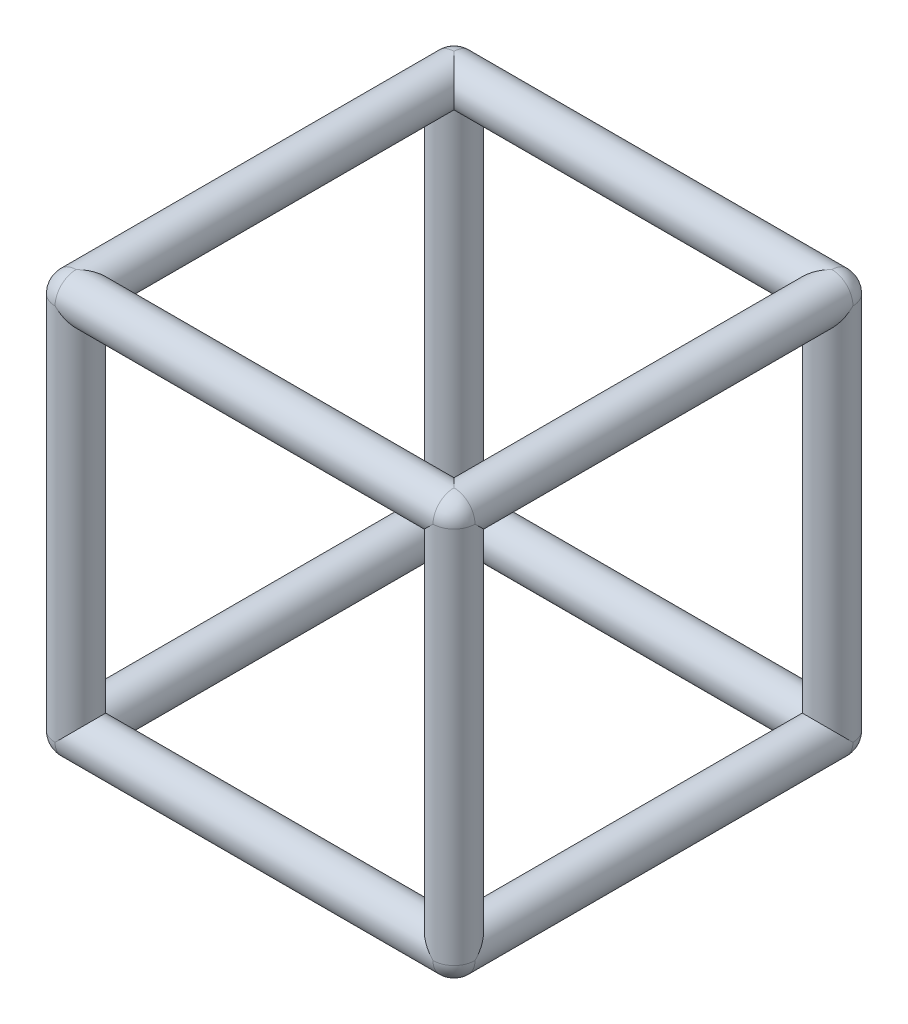
ISO-10303-21;
HEADER;
FILE_DESCRIPTION(('STEP AP214'),'2;1');
FILE_NAME('part.step','',(''),(''),'','','');
FILE_SCHEMA(('AUTOMOTIVE_DESIGN { 1 0 10303 214 1 1 1 1 }'));
ENDSEC;
DATA;
#1=APPLICATION_CONTEXT('core data for automotive mechanical design processes');
#2=APPLICATION_PROTOCOL_DEFINITION('international standard','automotive_design',2000,#1);
#3=PRODUCT_CONTEXT('',#1,'mechanical');
#4=PRODUCT('Part','Part','',(#3));
#5=PRODUCT_RELATED_PRODUCT_CATEGORY('part','',(#4));
#6=PRODUCT_DEFINITION_FORMATION('','',#4);
#7=PRODUCT_DEFINITION_CONTEXT('part definition',#1,'design');
#8=PRODUCT_DEFINITION('design','',#6,#7);
#9=PRODUCT_DEFINITION_SHAPE('','',#8);
#10=(LENGTH_UNIT() NAMED_UNIT(*) SI_UNIT(.MILLI.,.METRE.));
#11=(NAMED_UNIT(*) PLANE_ANGLE_UNIT() SI_UNIT($,.RADIAN.));
#12=(NAMED_UNIT(*) SI_UNIT($,.STERADIAN.) SOLID_ANGLE_UNIT());
#13=UNCERTAINTY_MEASURE_WITH_UNIT(LENGTH_MEASURE(1.E-05),#10,'distance_accuracy_value','');
#14=(GEOMETRIC_REPRESENTATION_CONTEXT(3) GLOBAL_UNCERTAINTY_ASSIGNED_CONTEXT((#13)) GLOBAL_UNIT_ASSIGNED_CONTEXT((#10,
#11,#12)) REPRESENTATION_CONTEXT('',''));
#15=CARTESIAN_POINT('',(0.,0.,0.));
#16=DIRECTION('',(0.,0.,1.));
#17=DIRECTION('',(1.,0.,0.));
#18=AXIS2_PLACEMENT_3D('',#15,#16,#17);
#19=CARTESIAN_POINT('',(-114.3,254.,-114.3));
#20=DIRECTION('',(0.,-1.,0.));
#21=DIRECTION('',(0.,0.,-1.));
#22=AXIS2_PLACEMENT_3D('',#19,#20,#21);
#23=CYLINDRICAL_SURFACE('',#22,12.7);
#24=CARTESIAN_POINT('',(-114.3,241.3,-114.3));
#25=DIRECTION('',(0.,-0.707106781186547,-0.707106781186547));
#26=DIRECTION('',(0.,-0.707106781186547,0.707106781186547));
#27=AXIS2_PLACEMENT_3D('',#24,#25,#26);
#28=ELLIPSE('',#27,17.9605122421383,12.7);
#29=CARTESIAN_POINT('',(-127.,241.3,-114.3));
#30=VERTEX_POINT('',#29);
#31=CARTESIAN_POINT('',(-105.319743878931,232.319743878931,-105.319743878931));
#32=VERTEX_POINT('',#31);
#33=EDGE_CURVE('E245',#30,#32,#28,.F.);
#34=ORIENTED_EDGE('',*,*,#33,.F.);
#35=CARTESIAN_POINT('',(-114.3,241.3,-114.3));
#36=DIRECTION('',(0.,-1.,0.));
#37=DIRECTION('',(0.,0.,-1.));
#38=AXIS2_PLACEMENT_3D('',#35,#36,#37);
#39=CIRCLE('',#38,12.7);
#40=CARTESIAN_POINT('',(-114.3,241.3,-127.));
#41=VERTEX_POINT('',#40);
#42=EDGE_CURVE('E264',#30,#41,#39,.T.);
#43=ORIENTED_EDGE('',*,*,#42,.T.);
#44=CARTESIAN_POINT('',(-114.3,241.3,-114.3));
#45=DIRECTION('',(-0.707106781186547,-0.707106781186547,0.));
#46=DIRECTION('',(0.707106781186547,-0.707106781186547,0.));
#47=AXIS2_PLACEMENT_3D('',#44,#45,#46);
#48=ELLIPSE('',#47,17.9605122421383,12.7);
#49=EDGE_CURVE('E258',#32,#41,#48,.F.);
#50=ORIENTED_EDGE('',*,*,#49,.F.);
#51=EDGE_LOOP('',(#34,#43,#50));
#52=FACE_BOUND('',#51,.T.);
#53=CARTESIAN_POINT('',(-114.3,12.7,-114.3));
#54=DIRECTION('',(0.,-0.707106781186547,0.707106781186547));
#55=DIRECTION('',(0.,-0.707106781186547,-0.707106781186547));
#56=AXIS2_PLACEMENT_3D('',#53,#54,#55);
#57=ELLIPSE('',#56,17.9605122421383,12.7);
#58=CARTESIAN_POINT('',(-105.319743878931,21.6802561210692,-105.319743878931));
#59=VERTEX_POINT('',#58);
#60=CARTESIAN_POINT('',(-127.,12.7,-114.3));
#61=VERTEX_POINT('',#60);
#62=EDGE_CURVE('E187',#59,#61,#57,.T.);
#63=ORIENTED_EDGE('',*,*,#62,.F.);
#64=CARTESIAN_POINT('',(-114.3,12.7,-114.3));
#65=DIRECTION('',(0.707106781186547,-0.707106781186547,0.));
#66=DIRECTION('',(-0.707106781186547,-0.707106781186547,0.));
#67=AXIS2_PLACEMENT_3D('',#64,#65,#66);
#68=ELLIPSE('',#67,17.9605122421383,12.7);
#69=CARTESIAN_POINT('',(-114.3,12.7,-127.));
#70=VERTEX_POINT('',#69);
#71=EDGE_CURVE('E250',#70,#59,#68,.T.);
#72=ORIENTED_EDGE('',*,*,#71,.F.);
#73=CARTESIAN_POINT('',(-114.3,12.7,-114.3));
#74=DIRECTION('',(0.,-1.,0.));
#75=DIRECTION('',(0.,0.,-1.));
#76=AXIS2_PLACEMENT_3D('',#73,#74,#75);
#77=CIRCLE('',#76,12.7);
#78=EDGE_CURVE('E161',#70,#61,#77,.F.);
#79=ORIENTED_EDGE('',*,*,#78,.T.);
#80=EDGE_LOOP('',(#63,#72,#79));
#81=FACE_BOUND('',#80,.T.);
#82=ADVANCED_FACE('F39',(#52,#81),#23,.T.);
#83=CARTESIAN_POINT('',(114.3,241.3,-114.3));
#84=DIRECTION('',(-1.,0.,0.));
#85=DIRECTION('',(0.,0.,1.));
#86=AXIS2_PLACEMENT_3D('',#83,#84,#85);
#87=CYLINDRICAL_SURFACE('',#86,12.7);
#88=CARTESIAN_POINT('',(-114.3,241.3,-114.3));
#89=DIRECTION('',(-0.707106781186547,0.,0.707106781186547));
#90=DIRECTION('',(-0.707106781186547,0.,-0.707106781186547));
#91=AXIS2_PLACEMENT_3D('',#88,#89,#90);
#92=ELLIPSE('',#91,17.9605122421383,12.7);
#93=CARTESIAN_POINT('',(-114.3,254.,-114.3));
#94=VERTEX_POINT('',#93);
#95=EDGE_CURVE('E237',#32,#94,#92,.T.);
#96=ORIENTED_EDGE('',*,*,#95,.F.);
#97=ORIENTED_EDGE('',*,*,#49,.T.);
#98=CARTESIAN_POINT('',(-114.3,241.3,-114.3));
#99=DIRECTION('',(1.,0.,0.));
#100=DIRECTION('',(0.,0.,-1.));
#101=AXIS2_PLACEMENT_3D('',#98,#99,#100);
#102=CIRCLE('',#101,12.7);
#103=EDGE_CURVE('E253',#41,#94,#102,.T.);
#104=ORIENTED_EDGE('',*,*,#103,.T.);
#105=EDGE_LOOP('',(#96,#97,#104));
#106=FACE_BOUND('',#105,.T.);
#107=CARTESIAN_POINT('',(114.3,241.3,-114.3));
#108=DIRECTION('',(-0.707106781186547,0.,-0.707106781186547));
#109=DIRECTION('',(-0.707106781186547,0.,0.707106781186547));
#110=AXIS2_PLACEMENT_3D('',#107,#108,#109);
#111=ELLIPSE('',#110,17.9605122421383,12.7);
#112=CARTESIAN_POINT('',(114.3,254.,-114.3));
#113=VERTEX_POINT('',#112);
#114=CARTESIAN_POINT('',(105.319743878931,232.319743878931,-105.319743878931));
#115=VERTEX_POINT('',#114);
#116=EDGE_CURVE('E197',#113,#115,#111,.F.);
#117=ORIENTED_EDGE('',*,*,#116,.F.);
#118=CARTESIAN_POINT('',(114.3,241.3,-114.3));
#119=DIRECTION('',(1.,0.,0.));
#120=DIRECTION('',(0.,0.,-1.));
#121=AXIS2_PLACEMENT_3D('',#118,#119,#120);
#122=CIRCLE('',#121,12.7);
#123=CARTESIAN_POINT('',(114.3,241.3,-127.));
#124=VERTEX_POINT('',#123);
#125=EDGE_CURVE('E259',#124,#113,#122,.T.);
#126=ORIENTED_EDGE('',*,*,#125,.F.);
#127=CARTESIAN_POINT('',(114.3,241.3,-114.3));
#128=DIRECTION('',(-0.707106781186547,0.707106781186547,0.));
#129=DIRECTION('',(-0.707106781186547,-0.707106781186547,0.));
#130=AXIS2_PLACEMENT_3D('',#127,#128,#129);
#131=ELLIPSE('',#130,17.9605122421383,12.7);
#132=EDGE_CURVE('E254',#115,#124,#131,.F.);
#133=ORIENTED_EDGE('',*,*,#132,.F.);
#134=EDGE_LOOP('',(#117,#126,#133));
#135=FACE_BOUND('',#134,.T.);
#136=ADVANCED_FACE('F323',(#106,#135),#87,.T.);
#137=CARTESIAN_POINT('',(-114.3,12.7,-114.3));
#138=DIRECTION('',(0.,1.,0.));
#139=DIRECTION('',(0.,0.,1.));
#140=AXIS2_PLACEMENT_3D('',#137,#138,#139);
#141=SPHERICAL_SURFACE('',#140,12.7);
#142=CARTESIAN_POINT('',(-114.3,12.7,-114.3));
#143=DIRECTION('',(1.,0.,0.));
#144=DIRECTION('',(0.,0.,-1.));
#145=AXIS2_PLACEMENT_3D('',#142,#143,#144);
#146=CIRCLE('',#145,12.7);
#147=CARTESIAN_POINT('',(-114.3,0.,-114.3));
#148=VERTEX_POINT('',#147);
#149=EDGE_CURVE('E242',#148,#70,#146,.T.);
#150=ORIENTED_EDGE('',*,*,#149,.F.);
#151=CARTESIAN_POINT('',(-114.3,12.7,-114.3));
#152=DIRECTION('',(0.,0.,1.));
#153=DIRECTION('',(1.,0.,0.));
#154=AXIS2_PLACEMENT_3D('',#151,#152,#153);
#155=CIRCLE('',#154,12.7);
#156=EDGE_CURVE('E53',#61,#148,#155,.T.);
#157=ORIENTED_EDGE('',*,*,#156,.F.);
#158=ORIENTED_EDGE('',*,*,#78,.F.);
#159=EDGE_LOOP('',(#150,#157,#158));
#160=FACE_BOUND('',#159,.T.);
#161=ADVANCED_FACE('F333',(#160),#141,.T.);
#162=CARTESIAN_POINT('',(114.3,254.,-114.3));
#163=DIRECTION('',(0.,-1.,0.));
#164=DIRECTION('',(0.,0.,-1.));
#165=AXIS2_PLACEMENT_3D('',#162,#163,#164);
#166=CYLINDRICAL_SURFACE('',#165,12.7);
#167=CARTESIAN_POINT('',(114.3,12.7,-114.3));
#168=DIRECTION('',(0.,-0.707106781186547,0.707106781186547));
#169=DIRECTION('',(0.,-0.707106781186547,-0.707106781186547));
#170=AXIS2_PLACEMENT_3D('',#167,#168,#169);
#171=ELLIPSE('',#170,17.9605122421383,12.7);
#172=CARTESIAN_POINT('',(127.,12.7,-114.3));
#173=VERTEX_POINT('',#172);
#174=CARTESIAN_POINT('',(105.319743878931,21.6802561210691,-105.319743878931));
#175=VERTEX_POINT('',#174);
#176=EDGE_CURVE('E61',#173,#175,#171,.T.);
#177=ORIENTED_EDGE('',*,*,#176,.F.);
#178=CARTESIAN_POINT('',(114.3,12.7,-114.3));
#179=DIRECTION('',(0.,-1.,0.));
#180=DIRECTION('',(0.,0.,-1.));
#181=AXIS2_PLACEMENT_3D('',#178,#179,#180);
#182=CIRCLE('',#181,12.7);
#183=CARTESIAN_POINT('',(114.3,12.7,-127.));
#184=VERTEX_POINT('',#183);
#185=EDGE_CURVE('E166',#173,#184,#182,.F.);
#186=ORIENTED_EDGE('',*,*,#185,.T.);
#187=CARTESIAN_POINT('',(114.3,12.7,-114.3));
#188=DIRECTION('',(-0.707106781186547,-0.707106781186547,0.));
#189=DIRECTION('',(0.707106781186547,-0.707106781186547,0.));
#190=AXIS2_PLACEMENT_3D('',#187,#188,#189);
#191=ELLIPSE('',#190,17.9605122421383,12.7);
#192=EDGE_CURVE('E163',#175,#184,#191,.T.);
#193=ORIENTED_EDGE('',*,*,#192,.F.);
#194=EDGE_LOOP('',(#177,#186,#193));
#195=FACE_BOUND('',#194,.T.);
#196=CARTESIAN_POINT('',(114.3,241.3,-114.3));
#197=DIRECTION('',(0.,-0.707106781186547,-0.707106781186547));
#198=DIRECTION('',(0.,-0.707106781186547,0.707106781186547));
#199=AXIS2_PLACEMENT_3D('',#196,#197,#198);
#200=ELLIPSE('',#199,17.9605122421383,12.7);
#201=CARTESIAN_POINT('',(127.,241.3,-114.3));
#202=VERTEX_POINT('',#201);
#203=EDGE_CURVE('E192',#115,#202,#200,.F.);
#204=ORIENTED_EDGE('',*,*,#203,.F.);
#205=ORIENTED_EDGE('',*,*,#132,.T.);
#206=CARTESIAN_POINT('',(114.3,241.3,-114.3));
#207=DIRECTION('',(0.,-1.,0.));
#208=DIRECTION('',(0.,0.,-1.));
#209=AXIS2_PLACEMENT_3D('',#206,#207,#208);
#210=CIRCLE('',#209,12.7);
#211=EDGE_CURVE('E248',#124,#202,#210,.T.);
#212=ORIENTED_EDGE('',*,*,#211,.T.);
#213=EDGE_LOOP('',(#204,#205,#212));
#214=FACE_BOUND('',#213,.T.);
#215=ADVANCED_FACE('F336',(#195,#214),#166,.T.);
#216=CARTESIAN_POINT('',(114.3,12.7,-114.3));
#217=DIRECTION('',(0.,1.,0.));
#218=DIRECTION('',(0.,0.,1.));
#219=AXIS2_PLACEMENT_3D('',#216,#217,#218);
#220=SPHERICAL_SURFACE('',#219,12.7);
#221=ORIENTED_EDGE('',*,*,#185,.F.);
#222=CARTESIAN_POINT('',(114.3,12.7,-114.3));
#223=DIRECTION('',(0.,0.,1.));
#224=DIRECTION('',(1.,0.,0.));
#225=AXIS2_PLACEMENT_3D('',#222,#223,#224);
#226=CIRCLE('',#225,12.7);
#227=CARTESIAN_POINT('',(114.3,0.,-114.3));
#228=VERTEX_POINT('',#227);
#229=EDGE_CURVE('E168',#228,#173,#226,.T.);
#230=ORIENTED_EDGE('',*,*,#229,.F.);
#231=CARTESIAN_POINT('',(114.3,12.7,-114.3));
#232=DIRECTION('',(1.,0.,0.));
#233=DIRECTION('',(0.,0.,-1.));
#234=AXIS2_PLACEMENT_3D('',#231,#232,#233);
#235=CIRCLE('',#234,12.7);
#236=EDGE_CURVE('E155',#184,#228,#235,.F.);
#237=ORIENTED_EDGE('',*,*,#236,.F.);
#238=EDGE_LOOP('',(#221,#230,#237));
#239=FACE_BOUND('',#238,.T.);
#240=ADVANCED_FACE('F170',(#239),#220,.T.);
#241=CARTESIAN_POINT('',(114.3,241.3,-114.3));
#242=DIRECTION('',(0.,1.,0.));
#243=DIRECTION('',(0.,0.,1.));
#244=AXIS2_PLACEMENT_3D('',#241,#242,#243);
#245=SPHERICAL_SURFACE('',#244,12.7);
#246=ORIENTED_EDGE('',*,*,#125,.T.);
#247=CARTESIAN_POINT('',(114.3,241.3,-114.3));
#248=DIRECTION('',(0.,0.,1.));
#249=DIRECTION('',(1.,0.,0.));
#250=AXIS2_PLACEMENT_3D('',#247,#248,#249);
#251=CIRCLE('',#250,12.7);
#252=EDGE_CURVE('E291',#202,#113,#251,.T.);
#253=ORIENTED_EDGE('',*,*,#252,.F.);
#254=ORIENTED_EDGE('',*,*,#211,.F.);
#255=EDGE_LOOP('',(#246,#253,#254));
#256=FACE_BOUND('',#255,.T.);
#257=ADVANCED_FACE('F318',(#256),#245,.T.);
#258=CARTESIAN_POINT('',(114.3,12.7,-114.3));
#259=DIRECTION('',(-1.,0.,0.));
#260=DIRECTION('',(0.,0.,1.));
#261=AXIS2_PLACEMENT_3D('',#258,#259,#260);
#262=CYLINDRICAL_SURFACE('',#261,12.7);
#263=CARTESIAN_POINT('',(114.3,12.7,-114.3));
#264=DIRECTION('',(-0.707106781186547,0.,-0.707106781186547));
#265=DIRECTION('',(-0.707106781186547,0.,0.707106781186547));
#266=AXIS2_PLACEMENT_3D('',#263,#264,#265);
#267=ELLIPSE('',#266,17.9605122421383,12.7);
#268=EDGE_CURVE('E156',#175,#228,#267,.F.);
#269=ORIENTED_EDGE('',*,*,#268,.F.);
#270=ORIENTED_EDGE('',*,*,#192,.T.);
#271=ORIENTED_EDGE('',*,*,#236,.T.);
#272=EDGE_LOOP('',(#269,#270,#271));
#273=FACE_BOUND('',#272,.T.);
#274=CARTESIAN_POINT('',(-114.3,12.7,-114.3));
#275=DIRECTION('',(-0.707106781186547,0.,0.707106781186547));
#276=DIRECTION('',(-0.707106781186547,0.,-0.707106781186547));
#277=AXIS2_PLACEMENT_3D('',#274,#275,#276);
#278=ELLIPSE('',#277,17.9605122421383,12.7);
#279=EDGE_CURVE('E182',#148,#59,#278,.T.);
#280=ORIENTED_EDGE('',*,*,#279,.F.);
#281=ORIENTED_EDGE('',*,*,#149,.T.);
#282=ORIENTED_EDGE('',*,*,#71,.T.);
#283=EDGE_LOOP('',(#280,#281,#282));
#284=FACE_BOUND('',#283,.T.);
#285=ADVANCED_FACE('F159',(#273,#284),#262,.T.);
#286=CARTESIAN_POINT('',(-114.3,254.,114.3));
#287=DIRECTION('',(0.,-1.,0.));
#288=DIRECTION('',(0.,0.,-1.));
#289=AXIS2_PLACEMENT_3D('',#286,#287,#288);
#290=CYLINDRICAL_SURFACE('',#289,12.7);
#291=CARTESIAN_POINT('',(-114.3,241.3,114.3));
#292=DIRECTION('',(0.,-1.,0.));
#293=DIRECTION('',(0.,0.,-1.));
#294=AXIS2_PLACEMENT_3D('',#291,#292,#293);
#295=CIRCLE('',#294,12.7);
#296=CARTESIAN_POINT('',(-114.3,241.3,127.));
#297=VERTEX_POINT('',#296);
#298=CARTESIAN_POINT('',(-127.,241.3,114.3));
#299=VERTEX_POINT('',#298);
#300=EDGE_CURVE('E224',#297,#299,#295,.T.);
#301=ORIENTED_EDGE('',*,*,#300,.T.);
#302=CARTESIAN_POINT('',(-114.3,241.3,114.3));
#303=DIRECTION('',(0.,0.707106781186547,-0.707106781186547));
#304=DIRECTION('',(0.,-0.707106781186547,-0.707106781186547));
#305=AXIS2_PLACEMENT_3D('',#302,#303,#304);
#306=ELLIPSE('',#305,17.9605122421383,12.7);
#307=CARTESIAN_POINT('',(-105.319743878931,232.319743878931,105.319743878931));
#308=VERTEX_POINT('',#307);
#309=EDGE_CURVE('E235',#299,#308,#306,.F.);
#310=ORIENTED_EDGE('',*,*,#309,.T.);
#311=CARTESIAN_POINT('',(-114.3,241.3,114.3));
#312=DIRECTION('',(-0.707106781186547,-0.707106781186547,0.));
#313=DIRECTION('',(0.707106781186547,-0.707106781186547,0.));
#314=AXIS2_PLACEMENT_3D('',#311,#312,#313);
#315=ELLIPSE('',#314,17.9605122421383,12.7);
#316=EDGE_CURVE('E219',#297,#308,#315,.F.);
#317=ORIENTED_EDGE('',*,*,#316,.F.);
#318=EDGE_LOOP('',(#301,#310,#317));
#319=FACE_BOUND('',#318,.T.);
#320=CARTESIAN_POINT('',(-114.3,12.7,114.3));
#321=DIRECTION('',(0.,-0.707106781186547,-0.707106781186547));
#322=DIRECTION('',(0.,-0.707106781186547,0.707106781186547));
#323=AXIS2_PLACEMENT_3D('',#320,#321,#322);
#324=ELLIPSE('',#323,17.9605122421383,12.7);
#325=CARTESIAN_POINT('',(-127.,12.7,114.3));
#326=VERTEX_POINT('',#325);
#327=CARTESIAN_POINT('',(-105.319743878931,21.6802561210692,105.319743878931));
#328=VERTEX_POINT('',#327);
#329=EDGE_CURVE('E174',#326,#328,#324,.T.);
#330=ORIENTED_EDGE('',*,*,#329,.F.);
#331=CARTESIAN_POINT('',(-114.3,12.7,114.3));
#332=DIRECTION('',(0.,-1.,0.));
#333=DIRECTION('',(0.,0.,-1.));
#334=AXIS2_PLACEMENT_3D('',#331,#332,#333);
#335=CIRCLE('',#334,12.7);
#336=CARTESIAN_POINT('',(-114.3,12.7,127.));
#337=VERTEX_POINT('',#336);
#338=EDGE_CURVE('E221',#326,#337,#335,.F.);
#339=ORIENTED_EDGE('',*,*,#338,.T.);
#340=CARTESIAN_POINT('',(-114.3,12.7,114.3));
#341=DIRECTION('',(0.707106781186547,-0.707106781186547,0.));
#342=DIRECTION('',(-0.707106781186547,-0.707106781186547,0.));
#343=AXIS2_PLACEMENT_3D('',#340,#341,#342);
#344=ELLIPSE('',#343,17.9605122421383,12.7);
#345=EDGE_CURVE('E202',#328,#337,#344,.T.);
#346=ORIENTED_EDGE('',*,*,#345,.F.);
#347=EDGE_LOOP('',(#330,#339,#346));
#348=FACE_BOUND('',#347,.T.);
#349=ADVANCED_FACE('F309',(#319,#348),#290,.T.);
#350=CARTESIAN_POINT('',(114.3,241.3,114.3));
#351=DIRECTION('',(-1.,0.,0.));
#352=DIRECTION('',(0.,0.,1.));
#353=AXIS2_PLACEMENT_3D('',#350,#351,#352);
#354=CYLINDRICAL_SURFACE('',#353,12.7);
#355=ORIENTED_EDGE('',*,*,#316,.T.);
#356=CARTESIAN_POINT('',(-114.3,241.3,114.3));
#357=DIRECTION('',(-0.707106781186547,0.,-0.707106781186547));
#358=DIRECTION('',(0.707106781186547,0.,-0.707106781186547));
#359=AXIS2_PLACEMENT_3D('',#356,#357,#358);
#360=ELLIPSE('',#359,17.9605122421383,12.7);
#361=CARTESIAN_POINT('',(-114.3,254.,114.3));
#362=VERTEX_POINT('',#361);
#363=EDGE_CURVE('E230',#308,#362,#360,.F.);
#364=ORIENTED_EDGE('',*,*,#363,.T.);
#365=CARTESIAN_POINT('',(-114.3,241.3,114.3));
#366=DIRECTION('',(1.,0.,0.));
#367=DIRECTION('',(0.,0.,-1.));
#368=AXIS2_PLACEMENT_3D('',#365,#366,#367);
#369=CIRCLE('',#368,12.7);
#370=EDGE_CURVE('E212',#362,#297,#369,.T.);
#371=ORIENTED_EDGE('',*,*,#370,.T.);
#372=EDGE_LOOP('',(#355,#364,#371));
#373=FACE_BOUND('',#372,.T.);
#374=CARTESIAN_POINT('',(114.3,241.3,114.3));
#375=DIRECTION('',(-0.707106781186547,0.,0.707106781186547));
#376=DIRECTION('',(-0.707106781186547,0.,-0.707106781186547));
#377=AXIS2_PLACEMENT_3D('',#374,#375,#376);
#378=ELLIPSE('',#377,17.9605122421383,12.7);
#379=CARTESIAN_POINT('',(105.319743878931,232.319743878931,105.319743878931));
#380=VERTEX_POINT('',#379);
#381=CARTESIAN_POINT('',(114.3,254.,114.3));
#382=VERTEX_POINT('',#381);
#383=EDGE_CURVE('E191',#380,#382,#378,.F.);
#384=ORIENTED_EDGE('',*,*,#383,.F.);
#385=CARTESIAN_POINT('',(114.3,241.3,114.3));
#386=DIRECTION('',(-0.707106781186547,0.707106781186547,0.));
#387=DIRECTION('',(-0.707106781186547,-0.707106781186547,0.));
#388=AXIS2_PLACEMENT_3D('',#385,#386,#387);
#389=ELLIPSE('',#388,17.9605122421383,12.7);
#390=CARTESIAN_POINT('',(114.3,241.3,127.));
#391=VERTEX_POINT('',#390);
#392=EDGE_CURVE('E211',#391,#380,#389,.F.);
#393=ORIENTED_EDGE('',*,*,#392,.F.);
#394=CARTESIAN_POINT('',(114.3,241.3,114.3));
#395=DIRECTION('',(1.,0.,0.));
#396=DIRECTION('',(0.,0.,-1.));
#397=AXIS2_PLACEMENT_3D('',#394,#395,#396);
#398=CIRCLE('',#397,12.7);
#399=EDGE_CURVE('E216',#382,#391,#398,.T.);
#400=ORIENTED_EDGE('',*,*,#399,.F.);
#401=EDGE_LOOP('',(#384,#393,#400));
#402=FACE_BOUND('',#401,.T.);
#403=ADVANCED_FACE('F282',(#373,#402),#354,.T.);
#404=CARTESIAN_POINT('',(114.3,254.,114.3));
#405=DIRECTION('',(0.,-1.,0.));
#406=DIRECTION('',(0.,0.,-1.));
#407=AXIS2_PLACEMENT_3D('',#404,#405,#406);
#408=CYLINDRICAL_SURFACE('',#407,12.7);
#409=CARTESIAN_POINT('',(114.3,12.7,114.3));
#410=DIRECTION('',(0.,-0.707106781186547,-0.707106781186547));
#411=DIRECTION('',(0.,-0.707106781186547,0.707106781186547));
#412=AXIS2_PLACEMENT_3D('',#409,#410,#411);
#413=ELLIPSE('',#412,17.9605122421383,12.7);
#414=CARTESIAN_POINT('',(105.319743878931,21.6802561210692,105.319743878931));
#415=VERTEX_POINT('',#414);
#416=CARTESIAN_POINT('',(127.,12.7,114.3));
#417=VERTEX_POINT('',#416);
#418=EDGE_CURVE('E173',#415,#417,#413,.T.);
#419=ORIENTED_EDGE('',*,*,#418,.F.);
#420=CARTESIAN_POINT('',(114.3,12.7,114.3));
#421=DIRECTION('',(-0.707106781186547,-0.707106781186547,0.));
#422=DIRECTION('',(0.707106781186547,-0.707106781186547,0.));
#423=AXIS2_PLACEMENT_3D('',#420,#421,#422);
#424=ELLIPSE('',#423,17.9605122421383,12.7);
#425=CARTESIAN_POINT('',(114.3,12.7,127.));
#426=VERTEX_POINT('',#425);
#427=EDGE_CURVE('E203',#426,#415,#424,.T.);
#428=ORIENTED_EDGE('',*,*,#427,.F.);
#429=CARTESIAN_POINT('',(114.3,12.7,114.3));
#430=DIRECTION('',(0.,-1.,0.));
#431=DIRECTION('',(0.,0.,-1.));
#432=AXIS2_PLACEMENT_3D('',#429,#430,#431);
#433=CIRCLE('',#432,12.7);
#434=EDGE_CURVE('E209',#426,#417,#433,.F.);
#435=ORIENTED_EDGE('',*,*,#434,.T.);
#436=EDGE_LOOP('',(#419,#428,#435));
#437=FACE_BOUND('',#436,.T.);
#438=CARTESIAN_POINT('',(114.3,241.3,114.3));
#439=DIRECTION('',(0.,-0.707106781186547,0.707106781186547));
#440=DIRECTION('',(0.,-0.707106781186547,-0.707106781186547));
#441=AXIS2_PLACEMENT_3D('',#438,#439,#440);
#442=ELLIPSE('',#441,17.9605122421383,12.7);
#443=CARTESIAN_POINT('',(127.,241.3,114.3));
#444=VERTEX_POINT('',#443);
#445=EDGE_CURVE('E186',#444,#380,#442,.F.);
#446=ORIENTED_EDGE('',*,*,#445,.F.);
#447=CARTESIAN_POINT('',(114.3,241.3,114.3));
#448=DIRECTION('',(0.,-1.,0.));
#449=DIRECTION('',(0.,0.,-1.));
#450=AXIS2_PLACEMENT_3D('',#447,#448,#449);
#451=CIRCLE('',#450,12.7);
#452=EDGE_CURVE('E207',#444,#391,#451,.T.);
#453=ORIENTED_EDGE('',*,*,#452,.T.);
#454=ORIENTED_EDGE('',*,*,#392,.T.);
#455=EDGE_LOOP('',(#446,#453,#454));
#456=FACE_BOUND('',#455,.T.);
#457=ADVANCED_FACE('F278',(#437,#456),#408,.T.);
#458=CARTESIAN_POINT('',(114.3,12.7,114.3));
#459=DIRECTION('',(-1.,0.,0.));
#460=DIRECTION('',(0.,0.,1.));
#461=AXIS2_PLACEMENT_3D('',#458,#459,#460);
#462=CYLINDRICAL_SURFACE('',#461,12.7);
#463=CARTESIAN_POINT('',(114.3,12.7,114.3));
#464=DIRECTION('',(-0.707106781186547,0.,0.707106781186547));
#465=DIRECTION('',(-0.707106781186547,0.,-0.707106781186547));
#466=AXIS2_PLACEMENT_3D('',#463,#464,#465);
#467=ELLIPSE('',#466,17.9605122421383,12.7);
#468=CARTESIAN_POINT('',(114.3,0.,114.3));
#469=VERTEX_POINT('',#468);
#470=EDGE_CURVE('E50',#469,#415,#467,.F.);
#471=ORIENTED_EDGE('',*,*,#470,.F.);
#472=CARTESIAN_POINT('',(114.3,12.7,114.3));
#473=DIRECTION('',(1.,0.,0.));
#474=DIRECTION('',(0.,0.,-1.));
#475=AXIS2_PLACEMENT_3D('',#472,#473,#474);
#476=CIRCLE('',#475,12.7);
#477=EDGE_CURVE('E227',#469,#426,#476,.F.);
#478=ORIENTED_EDGE('',*,*,#477,.T.);
#479=ORIENTED_EDGE('',*,*,#427,.T.);
#480=EDGE_LOOP('',(#471,#478,#479));
#481=FACE_BOUND('',#480,.T.);
#482=CARTESIAN_POINT('',(-114.3,12.7,114.3));
#483=DIRECTION('',(-0.707106781186547,0.,-0.707106781186547));
#484=DIRECTION('',(-0.707106781186547,0.,0.707106781186547));
#485=AXIS2_PLACEMENT_3D('',#482,#483,#484);
#486=ELLIPSE('',#485,17.9605122421383,12.7);
#487=CARTESIAN_POINT('',(-114.3,0.,114.3));
#488=VERTEX_POINT('',#487);
#489=EDGE_CURVE('E11',#328,#488,#486,.T.);
#490=ORIENTED_EDGE('',*,*,#489,.F.);
#491=ORIENTED_EDGE('',*,*,#345,.T.);
#492=CARTESIAN_POINT('',(-114.3,12.7,114.3));
#493=DIRECTION('',(1.,0.,0.));
#494=DIRECTION('',(0.,0.,-1.));
#495=AXIS2_PLACEMENT_3D('',#492,#493,#494);
#496=CIRCLE('',#495,12.7);
#497=EDGE_CURVE('E198',#337,#488,#496,.T.);
#498=ORIENTED_EDGE('',*,*,#497,.T.);
#499=EDGE_LOOP('',(#490,#491,#498));
#500=FACE_BOUND('',#499,.T.);
#501=ADVANCED_FACE('F275',(#481,#500),#462,.T.);
#502=CARTESIAN_POINT('',(-114.3,241.3,114.3));
#503=DIRECTION('',(0.,0.,-1.));
#504=DIRECTION('',(-1.,0.,0.));
#505=AXIS2_PLACEMENT_3D('',#502,#503,#504);
#506=CYLINDRICAL_SURFACE('',#505,12.7);
#507=CARTESIAN_POINT('',(-114.3,241.3,-114.3));
#508=DIRECTION('',(0.,0.,1.));
#509=DIRECTION('',(1.,0.,0.));
#510=AXIS2_PLACEMENT_3D('',#507,#508,#509);
#511=CIRCLE('',#510,12.7);
#512=EDGE_CURVE('E232',#94,#30,#511,.T.);
#513=ORIENTED_EDGE('',*,*,#512,.T.);
#514=ORIENTED_EDGE('',*,*,#33,.T.);
#515=ORIENTED_EDGE('',*,*,#95,.T.);
#516=EDGE_LOOP('',(#513,#514,#515));
#517=FACE_BOUND('',#516,.T.);
#518=ORIENTED_EDGE('',*,*,#309,.F.);
#519=CARTESIAN_POINT('',(-114.3,241.3,114.3));
#520=DIRECTION('',(0.,0.,1.));
#521=DIRECTION('',(1.,0.,0.));
#522=AXIS2_PLACEMENT_3D('',#519,#520,#521);
#523=CIRCLE('',#522,12.7);
#524=EDGE_CURVE('E236',#362,#299,#523,.T.);
#525=ORIENTED_EDGE('',*,*,#524,.F.);
#526=ORIENTED_EDGE('',*,*,#363,.F.);
#527=EDGE_LOOP('',(#518,#525,#526));
#528=FACE_BOUND('',#527,.T.);
#529=ADVANCED_FACE('F358',(#517,#528),#506,.T.);
#530=CARTESIAN_POINT('',(-114.3,241.3,-114.3));
#531=DIRECTION('',(0.,1.,0.));
#532=DIRECTION('',(0.,0.,1.));
#533=AXIS2_PLACEMENT_3D('',#530,#531,#532);
#534=SPHERICAL_SURFACE('',#533,12.7);
#535=ORIENTED_EDGE('',*,*,#42,.F.);
#536=ORIENTED_EDGE('',*,*,#512,.F.);
#537=ORIENTED_EDGE('',*,*,#103,.F.);
#538=EDGE_LOOP('',(#535,#536,#537));
#539=FACE_BOUND('',#538,.T.);
#540=ADVANCED_FACE('F41',(#539),#534,.T.);
#541=CARTESIAN_POINT('',(-114.3,12.7,114.3));
#542=DIRECTION('',(0.,1.,0.));
#543=DIRECTION('',(0.,0.,1.));
#544=AXIS2_PLACEMENT_3D('',#541,#542,#543);
#545=SPHERICAL_SURFACE('',#544,12.7);
#546=CARTESIAN_POINT('',(-114.3,12.7,114.3));
#547=DIRECTION('',(0.,0.,1.));
#548=DIRECTION('',(1.,0.,0.));
#549=AXIS2_PLACEMENT_3D('',#546,#547,#548);
#550=CIRCLE('',#549,12.7);
#551=EDGE_CURVE('E178',#326,#488,#550,.T.);
#552=ORIENTED_EDGE('',*,*,#551,.T.);
#553=ORIENTED_EDGE('',*,*,#497,.F.);
#554=ORIENTED_EDGE('',*,*,#338,.F.);
#555=EDGE_LOOP('',(#552,#553,#554));
#556=FACE_BOUND('',#555,.T.);
#557=ADVANCED_FACE('F302',(#556),#545,.T.);
#558=CARTESIAN_POINT('',(-114.3,241.3,114.3));
#559=DIRECTION('',(0.,1.,0.));
#560=DIRECTION('',(0.,0.,1.));
#561=AXIS2_PLACEMENT_3D('',#558,#559,#560);
#562=SPHERICAL_SURFACE('',#561,12.7);
#563=ORIENTED_EDGE('',*,*,#370,.F.);
#564=ORIENTED_EDGE('',*,*,#524,.T.);
#565=ORIENTED_EDGE('',*,*,#300,.F.);
#566=EDGE_LOOP('',(#563,#564,#565));
#567=FACE_BOUND('',#566,.T.);
#568=ADVANCED_FACE('F359',(#567),#562,.T.);
#569=CARTESIAN_POINT('',(114.3,12.7,114.3));
#570=DIRECTION('',(0.,1.,0.));
#571=DIRECTION('',(0.,0.,1.));
#572=AXIS2_PLACEMENT_3D('',#569,#570,#571);
#573=SPHERICAL_SURFACE('',#572,12.7);
#574=CARTESIAN_POINT('',(114.3,12.7,114.3));
#575=DIRECTION('',(0.,0.,1.));
#576=DIRECTION('',(1.,0.,0.));
#577=AXIS2_PLACEMENT_3D('',#574,#575,#576);
#578=CIRCLE('',#577,12.7);
#579=EDGE_CURVE('E167',#469,#417,#578,.T.);
#580=ORIENTED_EDGE('',*,*,#579,.T.);
#581=ORIENTED_EDGE('',*,*,#434,.F.);
#582=ORIENTED_EDGE('',*,*,#477,.F.);
#583=EDGE_LOOP('',(#580,#581,#582));
#584=FACE_BOUND('',#583,.T.);
#585=ADVANCED_FACE('F276',(#584),#573,.T.);
#586=CARTESIAN_POINT('',(114.3,241.3,114.3));
#587=DIRECTION('',(0.,1.,0.));
#588=DIRECTION('',(0.,0.,1.));
#589=AXIS2_PLACEMENT_3D('',#586,#587,#588);
#590=SPHERICAL_SURFACE('',#589,12.7);
#591=CARTESIAN_POINT('',(114.3,241.3,114.3));
#592=DIRECTION('',(0.,0.,1.));
#593=DIRECTION('',(1.,0.,0.));
#594=AXIS2_PLACEMENT_3D('',#591,#592,#593);
#595=CIRCLE('',#594,12.7);
#596=EDGE_CURVE('E287',#444,#382,#595,.T.);
#597=ORIENTED_EDGE('',*,*,#596,.T.);
#598=ORIENTED_EDGE('',*,*,#399,.T.);
#599=ORIENTED_EDGE('',*,*,#452,.F.);
#600=EDGE_LOOP('',(#597,#598,#599));
#601=FACE_BOUND('',#600,.T.);
#602=ADVANCED_FACE('F354',(#601),#590,.T.);
#603=CARTESIAN_POINT('',(114.3,12.7,114.3));
#604=DIRECTION('',(0.,0.,-1.));
#605=DIRECTION('',(-1.,0.,0.));
#606=AXIS2_PLACEMENT_3D('',#603,#604,#605);
#607=CYLINDRICAL_SURFACE('',#606,12.7);
#608=ORIENTED_EDGE('',*,*,#470,.T.);
#609=ORIENTED_EDGE('',*,*,#418,.T.);
#610=ORIENTED_EDGE('',*,*,#579,.F.);
#611=EDGE_LOOP('',(#608,#609,#610));
#612=FACE_BOUND('',#611,.T.);
#613=ORIENTED_EDGE('',*,*,#229,.T.);
#614=ORIENTED_EDGE('',*,*,#176,.T.);
#615=ORIENTED_EDGE('',*,*,#268,.T.);
#616=EDGE_LOOP('',(#613,#614,#615));
#617=FACE_BOUND('',#616,.T.);
#618=ADVANCED_FACE('F175',(#612,#617),#607,.T.);
#619=CARTESIAN_POINT('',(-114.3,12.7,114.3));
#620=DIRECTION('',(0.,0.,-1.));
#621=DIRECTION('',(-1.,0.,0.));
#622=AXIS2_PLACEMENT_3D('',#619,#620,#621);
#623=CYLINDRICAL_SURFACE('',#622,12.7);
#624=ORIENTED_EDGE('',*,*,#551,.F.);
#625=ORIENTED_EDGE('',*,*,#329,.T.);
#626=ORIENTED_EDGE('',*,*,#489,.T.);
#627=EDGE_LOOP('',(#624,#625,#626));
#628=FACE_BOUND('',#627,.T.);
#629=ORIENTED_EDGE('',*,*,#279,.T.);
#630=ORIENTED_EDGE('',*,*,#62,.T.);
#631=ORIENTED_EDGE('',*,*,#156,.T.);
#632=EDGE_LOOP('',(#629,#630,#631));
#633=FACE_BOUND('',#632,.T.);
#634=ADVANCED_FACE('F306',(#628,#633),#623,.T.);
#635=CARTESIAN_POINT('',(114.3,241.3,114.3));
#636=DIRECTION('',(0.,0.,-1.));
#637=DIRECTION('',(-1.,0.,0.));
#638=AXIS2_PLACEMENT_3D('',#635,#636,#637);
#639=CYLINDRICAL_SURFACE('',#638,12.7);
#640=ORIENTED_EDGE('',*,*,#445,.T.);
#641=ORIENTED_EDGE('',*,*,#383,.T.);
#642=ORIENTED_EDGE('',*,*,#596,.F.);
#643=EDGE_LOOP('',(#640,#641,#642));
#644=FACE_BOUND('',#643,.T.);
#645=ORIENTED_EDGE('',*,*,#252,.T.);
#646=ORIENTED_EDGE('',*,*,#116,.T.);
#647=ORIENTED_EDGE('',*,*,#203,.T.);
#648=EDGE_LOOP('',(#645,#646,#647));
#649=FACE_BOUND('',#648,.T.);
#650=ADVANCED_FACE('F290',(#644,#649),#639,.T.);
#651=CLOSED_SHELL('',(#82,#136,#161,#215,#240,#257,#285,#349,#403,#457,#501,#529,#540,#557,#568,
#585,#602,#618,#634,#650));
#652=MANIFOLD_SOLID_BREP('B2',#651);
#653=ADVANCED_BREP_SHAPE_REPRESENTATION('',(#18,#652),#14);
#654=SHAPE_DEFINITION_REPRESENTATION(#9,#653);
ENDSEC;
END-ISO-10303-21;
